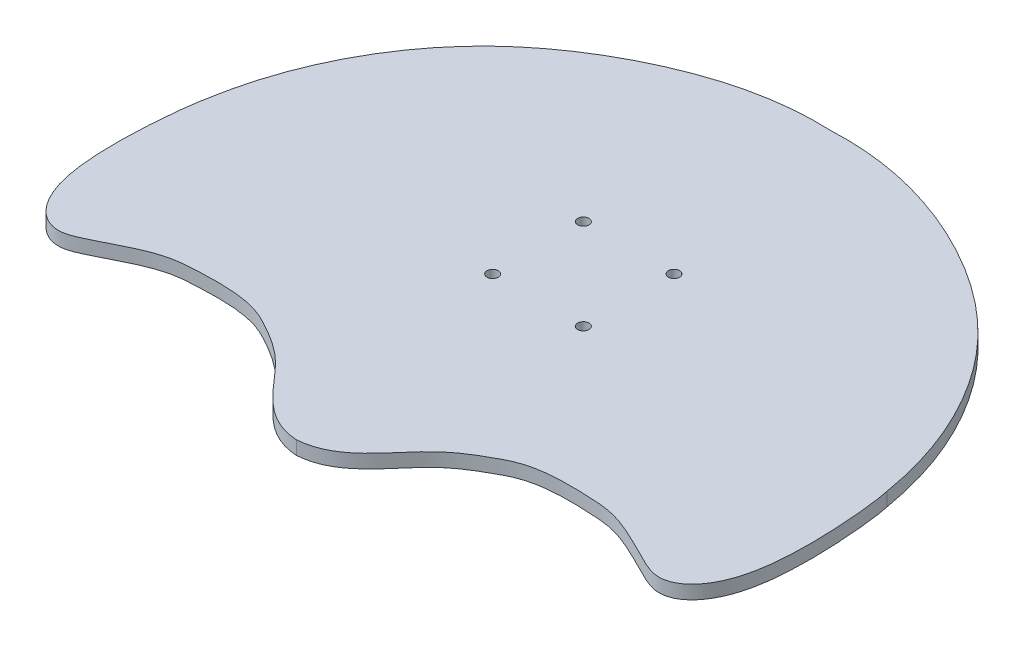
ISO-10303-21;
HEADER;
FILE_DESCRIPTION(('STEP AP214'),'2;1');
FILE_NAME('part.step','',(''),(''),'','','');
FILE_SCHEMA(('AUTOMOTIVE_DESIGN { 1 0 10303 214 1 1 1 1 }'));
ENDSEC;
DATA;
#1=APPLICATION_CONTEXT('core data for automotive mechanical design processes');
#2=APPLICATION_PROTOCOL_DEFINITION('international standard','automotive_design',2000,#1);
#3=PRODUCT_CONTEXT('',#1,'mechanical');
#4=PRODUCT('Part','Part','',(#3));
#5=PRODUCT_RELATED_PRODUCT_CATEGORY('part','',(#4));
#6=PRODUCT_DEFINITION_FORMATION('','',#4);
#7=PRODUCT_DEFINITION_CONTEXT('part definition',#1,'design');
#8=PRODUCT_DEFINITION('design','',#6,#7);
#9=PRODUCT_DEFINITION_SHAPE('','',#8);
#10=(LENGTH_UNIT() NAMED_UNIT(*) SI_UNIT(.MILLI.,.METRE.));
#11=(NAMED_UNIT(*) PLANE_ANGLE_UNIT() SI_UNIT($,.RADIAN.));
#12=(NAMED_UNIT(*) SI_UNIT($,.STERADIAN.) SOLID_ANGLE_UNIT());
#13=UNCERTAINTY_MEASURE_WITH_UNIT(LENGTH_MEASURE(1.E-05),#10,'distance_accuracy_value','');
#14=(GEOMETRIC_REPRESENTATION_CONTEXT(3) GLOBAL_UNCERTAINTY_ASSIGNED_CONTEXT((#13)) GLOBAL_UNIT_ASSIGNED_CONTEXT((#10,
#11,#12)) REPRESENTATION_CONTEXT('',''));
#15=CARTESIAN_POINT('',(0.,0.,0.));
#16=DIRECTION('',(0.,0.,1.));
#17=DIRECTION('',(1.,0.,0.));
#18=AXIS2_PLACEMENT_3D('',#15,#16,#17);
#19=CARTESIAN_POINT('',(-190.5,7.62,0.));
#20=CARTESIAN_POINT('',(-192.064011792662,7.62,4.96350192621509));
#21=CARTESIAN_POINT('',(-201.967167765924,7.62,83.3146183109833));
#22=CARTESIAN_POINT('',(-174.696602041029,7.62,109.289958804391));
#23=CARTESIAN_POINT('',(-151.630121659032,7.62,100.567984898405));
#24=CARTESIAN_POINT('',(-131.410771519055,7.62,87.7197839609674));
#25=CARTESIAN_POINT('',(-96.8435676275136,7.62,85.3754033772216));
#26=CARTESIAN_POINT('',(-78.6925101438482,7.62,86.2588274201763));
#27=CARTESIAN_POINT('',(-58.8335330715194,7.62,96.8793824699203));
#28=CARTESIAN_POINT('',(-37.3059346099107,7.62,109.935798161985));
#29=CARTESIAN_POINT('',(-21.3496139460233,7.62,139.114767456721));
#30=CARTESIAN_POINT('',(1.40754784340045E-13,7.62,140.530090072389));
#31=B_SPLINE_CURVE_WITH_KNOTS('',3,(#19,#20,#21,#22,#23,#24,#25,#26,#27,#28,#29,#30),
.UNSPECIFIED.,.F.,.F.,(4,1,1,1,1,1,1,1,1,4),(0.,0.166997051795611,0.292320514089622,
0.319633117373991,0.426735310498713,0.458914050276757,0.609241775376387,0.641909703937047,
0.766802370245909,1.),.UNSPECIFIED.);
#32=DIRECTION('',(0.,-1.,0.));
#33=VECTOR('',#32,1.);
#34=SURFACE_OF_LINEAR_EXTRUSION('',#31,#33);
#35=CARTESIAN_POINT('',(-190.5,0.,0.));
#36=CARTESIAN_POINT('',(-192.064011792662,0.,4.96350192621509));
#37=CARTESIAN_POINT('',(-201.967167765924,0.,83.3146183109833));
#38=CARTESIAN_POINT('',(-174.696602041029,0.,109.289958804391));
#39=CARTESIAN_POINT('',(-151.630121659032,0.,100.567984898405));
#40=CARTESIAN_POINT('',(-131.410771519055,0.,87.7197839609674));
#41=CARTESIAN_POINT('',(-96.8435676275136,0.,85.3754033772216));
#42=CARTESIAN_POINT('',(-78.6925101438482,0.,86.2588274201763));
#43=CARTESIAN_POINT('',(-58.8335330715194,0.,96.8793824699203));
#44=CARTESIAN_POINT('',(-37.3059346099107,0.,109.935798161985));
#45=CARTESIAN_POINT('',(-21.3496139460233,0.,139.114767456721));
#46=CARTESIAN_POINT('',(1.40754784340045E-13,0.,140.530090072389));
#47=B_SPLINE_CURVE_WITH_KNOTS('',3,(#35,#36,#37,#38,#39,#40,#41,#42,#43,#44,#45,#46),
.UNSPECIFIED.,.F.,.F.,(4,1,1,1,1,1,1,1,1,4),(0.,0.166997051795611,0.292320514089622,
0.319633117373991,0.426735310498713,0.458914050276757,0.609241775376387,0.641909703937047,
0.766802370245909,1.),.UNSPECIFIED.);
#48=CARTESIAN_POINT('',(-190.5,0.,0.));
#49=VERTEX_POINT('',#48);
#50=CARTESIAN_POINT('',(-1.06334839341837E-13,0.,140.530090072389));
#51=VERTEX_POINT('',#50);
#52=EDGE_CURVE('E140',#49,#51,#47,.T.);
#53=ORIENTED_EDGE('',*,*,#52,.T.);
#54=DIRECTION('',(0.,-1.,0.));
#55=VECTOR('',#54,1.);
#56=CARTESIAN_POINT('',(-1.06334839341837E-13,7.62,140.530090072389));
#57=LINE('',#56,#55);
#58=CARTESIAN_POINT('',(-1.06334839341837E-13,7.62,140.530090072389));
#59=VERTEX_POINT('',#58);
#60=EDGE_CURVE('E11',#59,#51,#57,.T.);
#61=ORIENTED_EDGE('',*,*,#60,.F.);
#62=CARTESIAN_POINT('',(-190.5,7.62,0.));
#63=VERTEX_POINT('',#62);
#64=EDGE_CURVE('E99',#63,#59,#31,.T.);
#65=ORIENTED_EDGE('',*,*,#64,.F.);
#66=DIRECTION('',(0.,-1.,0.));
#67=VECTOR('',#66,1.);
#68=CARTESIAN_POINT('',(-190.5,7.62,0.));
#69=LINE('',#68,#67);
#70=EDGE_CURVE('E111',#63,#49,#69,.T.);
#71=ORIENTED_EDGE('',*,*,#70,.T.);
#72=EDGE_LOOP('',(#53,#61,#65,#71));
#73=FACE_BOUND('',#72,.T.);
#74=ADVANCED_FACE('F46',(#73),#34,.F.);
#75=CARTESIAN_POINT('',(-1.06334839341837E-13,7.62,140.530090072389));
#76=CARTESIAN_POINT('',(21.3496139460233,7.62,139.114767456721));
#77=CARTESIAN_POINT('',(37.3059346099107,7.62,109.935798161984));
#78=CARTESIAN_POINT('',(58.8335330715195,7.62,96.8793824699203));
#79=CARTESIAN_POINT('',(78.6925101438482,7.62,86.2588274201763));
#80=CARTESIAN_POINT('',(96.8435676275136,7.62,85.3754033772216));
#81=CARTESIAN_POINT('',(131.410771519055,7.62,87.7197839609674));
#82=CARTESIAN_POINT('',(151.630121659032,7.62,100.567984898405));
#83=CARTESIAN_POINT('',(174.696602041029,7.62,109.289958804391));
#84=CARTESIAN_POINT('',(201.967167765924,7.62,83.3146183109832));
#85=CARTESIAN_POINT('',(192.064011792662,7.62,4.96350192621503));
#86=CARTESIAN_POINT('',(190.5,7.62,0.));
#87=B_SPLINE_CURVE_WITH_KNOTS('',3,(#75,#76,#77,#78,#79,#80,#81,#82,#83,#84,#85,#86),
.UNSPECIFIED.,.F.,.F.,(4,1,1,1,1,1,1,1,1,4),(0.,0.233197629754091,0.358090296062953,
0.390758224623613,0.541085949723243,0.573264689501287,0.680366882626009,0.707679485910378,
0.833002948204389,1.),.UNSPECIFIED.);
#88=DIRECTION('',(0.,-1.,0.));
#89=VECTOR('',#88,1.);
#90=SURFACE_OF_LINEAR_EXTRUSION('',#87,#89);
#91=CARTESIAN_POINT('',(-1.06334839341837E-13,0.,140.530090072389));
#92=CARTESIAN_POINT('',(21.3496139460233,0.,139.114767456721));
#93=CARTESIAN_POINT('',(37.3059346099107,0.,109.935798161984));
#94=CARTESIAN_POINT('',(58.8335330715195,0.,96.8793824699203));
#95=CARTESIAN_POINT('',(78.6925101438482,0.,86.2588274201763));
#96=CARTESIAN_POINT('',(96.8435676275136,0.,85.3754033772216));
#97=CARTESIAN_POINT('',(131.410771519055,0.,87.7197839609674));
#98=CARTESIAN_POINT('',(151.630121659032,0.,100.567984898405));
#99=CARTESIAN_POINT('',(174.696602041029,0.,109.289958804391));
#100=CARTESIAN_POINT('',(201.967167765924,0.,83.3146183109832));
#101=CARTESIAN_POINT('',(192.064011792662,0.,4.96350192621503));
#102=CARTESIAN_POINT('',(190.5,0.,0.));
#103=B_SPLINE_CURVE_WITH_KNOTS('',3,(#91,#92,#93,#94,#95,#96,#97,#98,#99,#100,#101,#102),
.UNSPECIFIED.,.F.,.F.,(4,1,1,1,1,1,1,1,1,4),(0.,0.233197629754091,0.358090296062953,
0.390758224623613,0.541085949723243,0.573264689501287,0.680366882626009,0.707679485910378,
0.833002948204389,1.),.UNSPECIFIED.);
#104=CARTESIAN_POINT('',(190.5,0.,0.));
#105=VERTEX_POINT('',#104);
#106=EDGE_CURVE('E104',#51,#105,#103,.T.);
#107=ORIENTED_EDGE('',*,*,#106,.T.);
#108=DIRECTION('',(0.,-1.,0.));
#109=VECTOR('',#108,1.);
#110=CARTESIAN_POINT('',(190.5,7.62,0.));
#111=LINE('',#110,#109);
#112=CARTESIAN_POINT('',(190.5,7.62,0.));
#113=VERTEX_POINT('',#112);
#114=EDGE_CURVE('E56',#113,#105,#111,.T.);
#115=ORIENTED_EDGE('',*,*,#114,.F.);
#116=EDGE_CURVE('E94',#59,#113,#87,.T.);
#117=ORIENTED_EDGE('',*,*,#116,.F.);
#118=ORIENTED_EDGE('',*,*,#60,.T.);
#119=EDGE_LOOP('',(#107,#115,#117,#118));
#120=FACE_BOUND('',#119,.T.);
#121=ADVANCED_FACE('F103',(#120),#90,.F.);
#122=CARTESIAN_POINT('',(190.5,7.62,0.));
#123=CARTESIAN_POINT('',(184.392726562295,7.62,-37.5370382365467));
#124=CARTESIAN_POINT('',(157.261289846749,7.62,-93.9640934852783));
#125=CARTESIAN_POINT('',(82.3874782016624,7.62,-146.622658841393));
#126=CARTESIAN_POINT('',(31.3113741429568,7.62,-160.799884185231));
#127=CARTESIAN_POINT('',(0.,7.62,-159.189909927611));
#128=B_SPLINE_CURVE_WITH_KNOTS('',3,(#122,#123,#124,#125,#126,#127),.UNSPECIFIED.,.F.,.F.,(4,1,
1,4),(0.,0.424401365551712,0.65636958095173,1.),.UNSPECIFIED.);
#129=DIRECTION('',(0.,-1.,0.));
#130=VECTOR('',#129,1.);
#131=SURFACE_OF_LINEAR_EXTRUSION('',#128,#130);
#132=CARTESIAN_POINT('',(190.5,0.,0.));
#133=CARTESIAN_POINT('',(184.392726562295,0.,-37.5370382365467));
#134=CARTESIAN_POINT('',(157.261289846749,0.,-93.9640934852783));
#135=CARTESIAN_POINT('',(82.3874782016624,0.,-146.622658841393));
#136=CARTESIAN_POINT('',(31.3113741429568,0.,-160.799884185231));
#137=CARTESIAN_POINT('',(0.,0.,-159.189909927611));
#138=B_SPLINE_CURVE_WITH_KNOTS('',3,(#132,#133,#134,#135,#136,#137),.UNSPECIFIED.,.F.,.F.,(4,1,
1,4),(0.,0.424401365551712,0.65636958095173,1.),.UNSPECIFIED.);
#139=CARTESIAN_POINT('',(0.,0.,-159.189909927611));
#140=VERTEX_POINT('',#139);
#141=EDGE_CURVE('E81',#105,#140,#138,.T.);
#142=ORIENTED_EDGE('',*,*,#141,.T.);
#143=DIRECTION('',(0.,-1.,0.));
#144=VECTOR('',#143,1.);
#145=CARTESIAN_POINT('',(0.,7.62,-159.189909927611));
#146=LINE('',#145,#144);
#147=CARTESIAN_POINT('',(0.,7.62,-159.189909927611));
#148=VERTEX_POINT('',#147);
#149=EDGE_CURVE('E106',#148,#140,#146,.T.);
#150=ORIENTED_EDGE('',*,*,#149,.F.);
#151=EDGE_CURVE('E97',#113,#148,#128,.T.);
#152=ORIENTED_EDGE('',*,*,#151,.F.);
#153=ORIENTED_EDGE('',*,*,#114,.T.);
#154=EDGE_LOOP('',(#142,#150,#152,#153));
#155=FACE_BOUND('',#154,.T.);
#156=ADVANCED_FACE('F107',(#155),#131,.F.);
#157=CARTESIAN_POINT('',(0.,7.62,-159.189909927611));
#158=CARTESIAN_POINT('',(-31.3113741429568,7.62,-160.799884185231));
#159=CARTESIAN_POINT('',(-82.3874782016624,7.62,-146.622658841393));
#160=CARTESIAN_POINT('',(-157.261289846749,7.62,-93.9640934852783));
#161=CARTESIAN_POINT('',(-184.392726562295,7.62,-37.5370382365467));
#162=CARTESIAN_POINT('',(-190.5,7.62,0.));
#163=B_SPLINE_CURVE_WITH_KNOTS('',3,(#157,#158,#159,#160,#161,#162),.UNSPECIFIED.,.F.,.F.,(4,1,
1,4),(0.,0.34363041904827,0.575598634448288,1.),.UNSPECIFIED.);
#164=DIRECTION('',(0.,-1.,0.));
#165=VECTOR('',#164,1.);
#166=SURFACE_OF_LINEAR_EXTRUSION('',#163,#165);
#167=CARTESIAN_POINT('',(0.,0.,-159.189909927611));
#168=CARTESIAN_POINT('',(-31.3113741429568,0.,-160.799884185231));
#169=CARTESIAN_POINT('',(-82.3874782016624,0.,-146.622658841393));
#170=CARTESIAN_POINT('',(-157.261289846749,0.,-93.9640934852783));
#171=CARTESIAN_POINT('',(-184.392726562295,0.,-37.5370382365467));
#172=CARTESIAN_POINT('',(-190.5,0.,0.));
#173=B_SPLINE_CURVE_WITH_KNOTS('',3,(#167,#168,#169,#170,#171,#172),.UNSPECIFIED.,.F.,.F.,(4,1,
1,4),(0.,0.34363041904827,0.575598634448288,1.),.UNSPECIFIED.);
#174=EDGE_CURVE('E87',#140,#49,#173,.T.);
#175=ORIENTED_EDGE('',*,*,#174,.T.);
#176=ORIENTED_EDGE('',*,*,#70,.F.);
#177=EDGE_CURVE('E64',#148,#63,#163,.T.);
#178=ORIENTED_EDGE('',*,*,#177,.F.);
#179=ORIENTED_EDGE('',*,*,#149,.T.);
#180=EDGE_LOOP('',(#175,#176,#178,#179));
#181=FACE_BOUND('',#180,.T.);
#182=ADVANCED_FACE('F129',(#181),#166,.F.);
#183=CARTESIAN_POINT('',(-98.1259130559372,7.62,86.0527308590208));
#184=DIRECTION('',(0.,-1.,0.));
#185=DIRECTION('',(0.,0.,-1.));
#186=AXIS2_PLACEMENT_3D('',#183,#184,#185);
#187=PLANE('',#186);
#188=CARTESIAN_POINT('',(25.4,7.62,-45.72));
#189=DIRECTION('',(0.,-1.,0.));
#190=DIRECTION('',(0.,0.,-1.));
#191=AXIS2_PLACEMENT_3D('',#188,#189,#190);
#192=CIRCLE('',#191,3.175);
#193=CARTESIAN_POINT('',(25.4,7.62,-48.895));
#194=VERTEX_POINT('',#193);
#195=EDGE_CURVE('E209',#194,#194,#192,.T.);
#196=ORIENTED_EDGE('',*,*,#195,.T.);
#197=EDGE_LOOP('',(#196));
#198=FACE_BOUND('',#197,.T.);
#199=CARTESIAN_POINT('',(-25.4,7.62,-45.72));
#200=DIRECTION('',(0.,-1.,0.));
#201=DIRECTION('',(0.,0.,-1.));
#202=AXIS2_PLACEMENT_3D('',#199,#200,#201);
#203=CIRCLE('',#202,3.175);
#204=CARTESIAN_POINT('',(-25.4,7.62,-48.895));
#205=VERTEX_POINT('',#204);
#206=EDGE_CURVE('E221',#205,#205,#203,.T.);
#207=ORIENTED_EDGE('',*,*,#206,.T.);
#208=EDGE_LOOP('',(#207));
#209=FACE_BOUND('',#208,.T.);
#210=CARTESIAN_POINT('',(-25.4,7.62,5.07999999999999));
#211=DIRECTION('',(0.,-1.,0.));
#212=DIRECTION('',(0.,0.,-1.));
#213=AXIS2_PLACEMENT_3D('',#210,#211,#212);
#214=CIRCLE('',#213,3.175);
#215=CARTESIAN_POINT('',(-25.4,7.62,1.905));
#216=VERTEX_POINT('',#215);
#217=EDGE_CURVE('E229',#216,#216,#214,.T.);
#218=ORIENTED_EDGE('',*,*,#217,.T.);
#219=EDGE_LOOP('',(#218));
#220=FACE_BOUND('',#219,.T.);
#221=CARTESIAN_POINT('',(25.4,7.62,5.08));
#222=DIRECTION('',(0.,-1.,0.));
#223=DIRECTION('',(0.,0.,-1.));
#224=AXIS2_PLACEMENT_3D('',#221,#222,#223);
#225=CIRCLE('',#224,3.175);
#226=CARTESIAN_POINT('',(25.4,7.62,1.905));
#227=VERTEX_POINT('',#226);
#228=EDGE_CURVE('E143',#227,#227,#225,.T.);
#229=ORIENTED_EDGE('',*,*,#228,.T.);
#230=EDGE_LOOP('',(#229));
#231=FACE_BOUND('',#230,.T.);
#232=ORIENTED_EDGE('',*,*,#64,.T.);
#233=ORIENTED_EDGE('',*,*,#116,.T.);
#234=ORIENTED_EDGE('',*,*,#151,.T.);
#235=ORIENTED_EDGE('',*,*,#177,.T.);
#236=EDGE_LOOP('',(#232,#233,#234,#235));
#237=FACE_BOUND('',#236,.T.);
#238=ADVANCED_FACE('F95',(#198,#209,#220,#231,#237),#187,.F.);
#239=CARTESIAN_POINT('',(-98.1259130559372,0.,86.0527308590208));
#240=DIRECTION('',(0.,-1.,0.));
#241=DIRECTION('',(0.,0.,-1.));
#242=AXIS2_PLACEMENT_3D('',#239,#240,#241);
#243=PLANE('',#242);
#244=CARTESIAN_POINT('',(25.4,0.,-45.72));
#245=DIRECTION('',(0.,-1.,0.));
#246=DIRECTION('',(0.,0.,-1.));
#247=AXIS2_PLACEMENT_3D('',#244,#245,#246);
#248=CIRCLE('',#247,3.175);
#249=CARTESIAN_POINT('',(25.4,0.,-48.895));
#250=VERTEX_POINT('',#249);
#251=EDGE_CURVE('E211',#250,#250,#248,.T.);
#252=ORIENTED_EDGE('',*,*,#251,.F.);
#253=EDGE_LOOP('',(#252));
#254=FACE_BOUND('',#253,.T.);
#255=CARTESIAN_POINT('',(-25.4,0.,-45.72));
#256=DIRECTION('',(0.,-1.,0.));
#257=DIRECTION('',(0.,0.,-1.));
#258=AXIS2_PLACEMENT_3D('',#255,#256,#257);
#259=CIRCLE('',#258,3.175);
#260=CARTESIAN_POINT('',(-25.4,0.,-48.895));
#261=VERTEX_POINT('',#260);
#262=EDGE_CURVE('E215',#261,#261,#259,.T.);
#263=ORIENTED_EDGE('',*,*,#262,.F.);
#264=EDGE_LOOP('',(#263));
#265=FACE_BOUND('',#264,.T.);
#266=CARTESIAN_POINT('',(-25.4,0.,5.07999999999999));
#267=DIRECTION('',(0.,-1.,0.));
#268=DIRECTION('',(0.,0.,-1.));
#269=AXIS2_PLACEMENT_3D('',#266,#267,#268);
#270=CIRCLE('',#269,3.175);
#271=CARTESIAN_POINT('',(-25.4,0.,1.905));
#272=VERTEX_POINT('',#271);
#273=EDGE_CURVE('E225',#272,#272,#270,.T.);
#274=ORIENTED_EDGE('',*,*,#273,.F.);
#275=EDGE_LOOP('',(#274));
#276=FACE_BOUND('',#275,.T.);
#277=CARTESIAN_POINT('',(25.4,0.,5.08));
#278=DIRECTION('',(0.,-1.,0.));
#279=DIRECTION('',(0.,0.,-1.));
#280=AXIS2_PLACEMENT_3D('',#277,#278,#279);
#281=CIRCLE('',#280,3.175);
#282=CARTESIAN_POINT('',(25.4,0.,1.905));
#283=VERTEX_POINT('',#282);
#284=EDGE_CURVE('E148',#283,#283,#281,.T.);
#285=ORIENTED_EDGE('',*,*,#284,.F.);
#286=EDGE_LOOP('',(#285));
#287=FACE_BOUND('',#286,.T.);
#288=ORIENTED_EDGE('',*,*,#52,.F.);
#289=ORIENTED_EDGE('',*,*,#174,.F.);
#290=ORIENTED_EDGE('',*,*,#141,.F.);
#291=ORIENTED_EDGE('',*,*,#106,.F.);
#292=EDGE_LOOP('',(#288,#289,#290,#291));
#293=FACE_BOUND('',#292,.T.);
#294=ADVANCED_FACE('F178',(#254,#265,#276,#287,#293),#243,.T.);
#295=CARTESIAN_POINT('',(25.4,0.,5.08));
#296=DIRECTION('',(0.,-1.,0.));
#297=DIRECTION('',(0.,0.,-1.));
#298=AXIS2_PLACEMENT_3D('',#295,#296,#297);
#299=CYLINDRICAL_SURFACE('',#298,3.175);
#300=ORIENTED_EDGE('',*,*,#228,.F.);
#301=EDGE_LOOP('',(#300));
#302=FACE_BOUND('',#301,.T.);
#303=ORIENTED_EDGE('',*,*,#284,.T.);
#304=EDGE_LOOP('',(#303));
#305=FACE_BOUND('',#304,.T.);
#306=ADVANCED_FACE('F180',(#302,#305),#299,.F.);
#307=CARTESIAN_POINT('',(-25.4,0.,5.07999999999999));
#308=DIRECTION('',(0.,-1.,0.));
#309=DIRECTION('',(0.,0.,-1.));
#310=AXIS2_PLACEMENT_3D('',#307,#308,#309);
#311=CYLINDRICAL_SURFACE('',#310,3.175);
#312=ORIENTED_EDGE('',*,*,#217,.F.);
#313=EDGE_LOOP('',(#312));
#314=FACE_BOUND('',#313,.T.);
#315=ORIENTED_EDGE('',*,*,#273,.T.);
#316=EDGE_LOOP('',(#315));
#317=FACE_BOUND('',#316,.T.);
#318=ADVANCED_FACE('F186',(#314,#317),#311,.F.);
#319=CARTESIAN_POINT('',(-25.4,0.,-45.72));
#320=DIRECTION('',(0.,-1.,0.));
#321=DIRECTION('',(0.,0.,-1.));
#322=AXIS2_PLACEMENT_3D('',#319,#320,#321);
#323=CYLINDRICAL_SURFACE('',#322,3.175);
#324=ORIENTED_EDGE('',*,*,#206,.F.);
#325=EDGE_LOOP('',(#324));
#326=FACE_BOUND('',#325,.T.);
#327=ORIENTED_EDGE('',*,*,#262,.T.);
#328=EDGE_LOOP('',(#327));
#329=FACE_BOUND('',#328,.T.);
#330=ADVANCED_FACE('F196',(#326,#329),#323,.F.);
#331=CARTESIAN_POINT('',(25.4,0.,-45.72));
#332=DIRECTION('',(0.,-1.,0.));
#333=DIRECTION('',(0.,0.,-1.));
#334=AXIS2_PLACEMENT_3D('',#331,#332,#333);
#335=CYLINDRICAL_SURFACE('',#334,3.175);
#336=ORIENTED_EDGE('',*,*,#195,.F.);
#337=EDGE_LOOP('',(#336));
#338=FACE_BOUND('',#337,.T.);
#339=ORIENTED_EDGE('',*,*,#251,.T.);
#340=EDGE_LOOP('',(#339));
#341=FACE_BOUND('',#340,.T.);
#342=ADVANCED_FACE('F200',(#338,#341),#335,.F.);
#343=CLOSED_SHELL('',(#74,#121,#156,#182,#238,#294,#306,#318,#330,#342));
#344=MANIFOLD_SOLID_BREP('B2',#343);
#345=ADVANCED_BREP_SHAPE_REPRESENTATION('',(#18,#344),#14);
#346=SHAPE_DEFINITION_REPRESENTATION(#9,#345);
ENDSEC;
END-ISO-10303-21;
